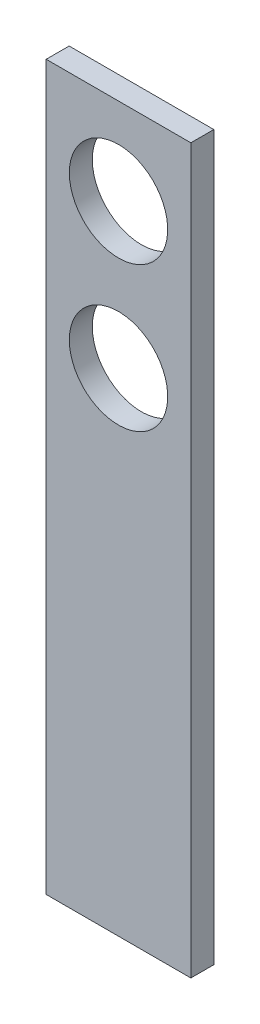
ISO-10303-21;
HEADER;
FILE_DESCRIPTION(('STEP AP214'),'2;1');
FILE_NAME('part.step','',(''),(''),'','','');
FILE_SCHEMA(('AUTOMOTIVE_DESIGN { 1 0 10303 214 1 1 1 1 }'));
ENDSEC;
DATA;
#1=APPLICATION_CONTEXT('core data for automotive mechanical design processes');
#2=APPLICATION_PROTOCOL_DEFINITION('international standard','automotive_design',2000,#1);
#3=PRODUCT_CONTEXT('',#1,'mechanical');
#4=PRODUCT('Part','Part','',(#3));
#5=PRODUCT_RELATED_PRODUCT_CATEGORY('part','',(#4));
#6=PRODUCT_DEFINITION_FORMATION('','',#4);
#7=PRODUCT_DEFINITION_CONTEXT('part definition',#1,'design');
#8=PRODUCT_DEFINITION('design','',#6,#7);
#9=PRODUCT_DEFINITION_SHAPE('','',#8);
#10=(LENGTH_UNIT() NAMED_UNIT(*) SI_UNIT(.MILLI.,.METRE.));
#11=(NAMED_UNIT(*) PLANE_ANGLE_UNIT() SI_UNIT($,.RADIAN.));
#12=(NAMED_UNIT(*) SI_UNIT($,.STERADIAN.) SOLID_ANGLE_UNIT());
#13=UNCERTAINTY_MEASURE_WITH_UNIT(LENGTH_MEASURE(1.E-05),#10,'distance_accuracy_value','');
#14=(GEOMETRIC_REPRESENTATION_CONTEXT(3) GLOBAL_UNCERTAINTY_ASSIGNED_CONTEXT((#13)) GLOBAL_UNIT_ASSIGNED_CONTEXT((#10,
#11,#12)) REPRESENTATION_CONTEXT('',''));
#15=CARTESIAN_POINT('',(0.,0.,0.));
#16=DIRECTION('',(0.,0.,1.));
#17=DIRECTION('',(1.,0.,0.));
#18=AXIS2_PLACEMENT_3D('',#15,#16,#17);
#19=CARTESIAN_POINT('',(-1.90934065934066,4.5467032967033,0.79375));
#20=DIRECTION('',(1.,0.,0.));
#21=DIRECTION('',(0.,1.,0.));
#22=AXIS2_PLACEMENT_3D('',#19,#20,#21);
#23=PLANE('',#22);
#24=DIRECTION('',(0.,-1.,0.));
#25=VECTOR('',#24,1.);
#26=CARTESIAN_POINT('',(-1.90934065934066,4.5467032967033,0.));
#27=LINE('',#26,#25);
#28=CARTESIAN_POINT('',(-1.90934065934066,4.5467032967033,0.));
#29=VERTEX_POINT('',#28);
#30=CARTESIAN_POINT('',(-1.90934065934066,-20.4532967032967,0.));
#31=VERTEX_POINT('',#30);
#32=EDGE_CURVE('E96',#29,#31,#27,.T.);
#33=ORIENTED_EDGE('',*,*,#32,.T.);
#34=DIRECTION('',(0.,0.,-1.));
#35=VECTOR('',#34,1.);
#36=CARTESIAN_POINT('',(-1.90934065934066,-20.4532967032967,0.79375));
#37=LINE('',#36,#35);
#38=CARTESIAN_POINT('',(-1.90934065934066,-20.4532967032967,0.79375));
#39=VERTEX_POINT('',#38);
#40=EDGE_CURVE('E11',#39,#31,#37,.T.);
#41=ORIENTED_EDGE('',*,*,#40,.F.);
#42=DIRECTION('',(0.,-1.,0.));
#43=VECTOR('',#42,1.);
#44=CARTESIAN_POINT('',(-1.90934065934066,4.5467032967033,0.79375));
#45=LINE('',#44,#43);
#46=CARTESIAN_POINT('',(-1.90934065934066,4.5467032967033,0.79375));
#47=VERTEX_POINT('',#46);
#48=EDGE_CURVE('E84',#47,#39,#45,.T.);
#49=ORIENTED_EDGE('',*,*,#48,.F.);
#50=DIRECTION('',(0.,0.,-1.));
#51=VECTOR('',#50,1.);
#52=CARTESIAN_POINT('',(-1.90934065934066,4.5467032967033,0.79375));
#53=LINE('',#52,#51);
#54=EDGE_CURVE('E92',#47,#29,#53,.T.);
#55=ORIENTED_EDGE('',*,*,#54,.T.);
#56=EDGE_LOOP('',(#33,#41,#49,#55));
#57=FACE_BOUND('',#56,.T.);
#58=ADVANCED_FACE('F33',(#57),#23,.F.);
#59=CARTESIAN_POINT('',(-1.90934065934066,-20.4532967032967,0.79375));
#60=DIRECTION('',(0.,1.,0.));
#61=DIRECTION('',(0.,0.,1.));
#62=AXIS2_PLACEMENT_3D('',#59,#60,#61);
#63=PLANE('',#62);
#64=DIRECTION('',(1.,0.,0.));
#65=VECTOR('',#64,1.);
#66=CARTESIAN_POINT('',(-1.90934065934066,-20.4532967032967,0.));
#67=LINE('',#66,#65);
#68=CARTESIAN_POINT('',(3.09065934065934,-20.4532967032967,0.));
#69=VERTEX_POINT('',#68);
#70=EDGE_CURVE('E88',#31,#69,#67,.T.);
#71=ORIENTED_EDGE('',*,*,#70,.T.);
#72=DIRECTION('',(0.,0.,-1.));
#73=VECTOR('',#72,1.);
#74=CARTESIAN_POINT('',(3.09065934065934,-20.4532967032967,0.79375));
#75=LINE('',#74,#73);
#76=CARTESIAN_POINT('',(3.09065934065934,-20.4532967032967,0.79375));
#77=VERTEX_POINT('',#76);
#78=EDGE_CURVE('E41',#77,#69,#75,.T.);
#79=ORIENTED_EDGE('',*,*,#78,.F.);
#80=DIRECTION('',(1.,0.,0.));
#81=VECTOR('',#80,1.);
#82=CARTESIAN_POINT('',(-1.90934065934066,-20.4532967032967,0.79375));
#83=LINE('',#82,#81);
#84=EDGE_CURVE('E79',#39,#77,#83,.T.);
#85=ORIENTED_EDGE('',*,*,#84,.F.);
#86=ORIENTED_EDGE('',*,*,#40,.T.);
#87=EDGE_LOOP('',(#71,#79,#85,#86));
#88=FACE_BOUND('',#87,.T.);
#89=ADVANCED_FACE('F87',(#88),#63,.F.);
#90=CARTESIAN_POINT('',(3.09065934065934,4.5467032967033,0.79375));
#91=DIRECTION('',(-1.,0.,0.));
#92=DIRECTION('',(0.,-1.,0.));
#93=AXIS2_PLACEMENT_3D('',#90,#91,#92);
#94=PLANE('',#93);
#95=DIRECTION('',(0.,1.,0.));
#96=VECTOR('',#95,1.);
#97=CARTESIAN_POINT('',(3.09065934065934,4.5467032967033,0.));
#98=LINE('',#97,#96);
#99=CARTESIAN_POINT('',(3.09065934065934,4.5467032967033,0.));
#100=VERTEX_POINT('',#99);
#101=EDGE_CURVE('E66',#69,#100,#98,.T.);
#102=ORIENTED_EDGE('',*,*,#101,.T.);
#103=DIRECTION('',(0.,0.,-1.));
#104=VECTOR('',#103,1.);
#105=CARTESIAN_POINT('',(3.09065934065934,4.5467032967033,0.79375));
#106=LINE('',#105,#104);
#107=CARTESIAN_POINT('',(3.09065934065934,4.5467032967033,0.79375));
#108=VERTEX_POINT('',#107);
#109=EDGE_CURVE('E89',#108,#100,#106,.T.);
#110=ORIENTED_EDGE('',*,*,#109,.F.);
#111=DIRECTION('',(0.,1.,0.));
#112=VECTOR('',#111,1.);
#113=CARTESIAN_POINT('',(3.09065934065934,4.5467032967033,0.79375));
#114=LINE('',#113,#112);
#115=EDGE_CURVE('E82',#77,#108,#114,.T.);
#116=ORIENTED_EDGE('',*,*,#115,.F.);
#117=ORIENTED_EDGE('',*,*,#78,.T.);
#118=EDGE_LOOP('',(#102,#110,#116,#117));
#119=FACE_BOUND('',#118,.T.);
#120=ADVANCED_FACE('F90',(#119),#94,.F.);
#121=CARTESIAN_POINT('',(-1.90934065934066,4.5467032967033,0.79375));
#122=DIRECTION('',(0.,-1.,0.));
#123=DIRECTION('',(0.,0.,-1.));
#124=AXIS2_PLACEMENT_3D('',#121,#122,#123);
#125=PLANE('',#124);
#126=DIRECTION('',(-1.,0.,0.));
#127=VECTOR('',#126,1.);
#128=CARTESIAN_POINT('',(-1.90934065934066,4.5467032967033,0.));
#129=LINE('',#128,#127);
#130=EDGE_CURVE('E72',#100,#29,#129,.T.);
#131=ORIENTED_EDGE('',*,*,#130,.T.);
#132=ORIENTED_EDGE('',*,*,#54,.F.);
#133=DIRECTION('',(-1.,0.,0.));
#134=VECTOR('',#133,1.);
#135=CARTESIAN_POINT('',(-1.90934065934066,4.5467032967033,0.79375));
#136=LINE('',#135,#134);
#137=EDGE_CURVE('E49',#108,#47,#136,.T.);
#138=ORIENTED_EDGE('',*,*,#137,.F.);
#139=ORIENTED_EDGE('',*,*,#109,.T.);
#140=EDGE_LOOP('',(#131,#132,#138,#139));
#141=FACE_BOUND('',#140,.T.);
#142=ADVANCED_FACE('F104',(#141),#125,.F.);
#143=CARTESIAN_POINT('',(0.,0.,0.79375));
#144=DIRECTION('',(0.,0.,1.));
#145=DIRECTION('',(1.,0.,0.));
#146=AXIS2_PLACEMENT_3D('',#143,#144,#145);
#147=PLANE('',#146);
#148=CARTESIAN_POINT('',(0.590659340659339,1.5467032967033,0.793749999999999));
#149=DIRECTION('',(0.,0.,-1.));
#150=DIRECTION('',(-1.,0.,0.));
#151=AXIS2_PLACEMENT_3D('',#148,#149,#150);
#152=CIRCLE('',#151,1.7);
#153=CARTESIAN_POINT('',(-1.10934065934066,1.5467032967033,0.793749999999999));
#154=VERTEX_POINT('',#153);
#155=EDGE_CURVE('E115',#154,#154,#152,.T.);
#156=ORIENTED_EDGE('',*,*,#155,.T.);
#157=EDGE_LOOP('',(#156));
#158=FACE_BOUND('',#157,.T.);
#159=CARTESIAN_POINT('',(0.590659340659339,-3.4532967032967,0.793749999999999));
#160=DIRECTION('',(0.,0.,-1.));
#161=DIRECTION('',(-1.,0.,0.));
#162=AXIS2_PLACEMENT_3D('',#159,#160,#161);
#163=CIRCLE('',#162,1.7);
#164=CARTESIAN_POINT('',(-1.10934065934066,-3.4532967032967,0.793749999999999));
#165=VERTEX_POINT('',#164);
#166=EDGE_CURVE('E99',#165,#165,#163,.T.);
#167=ORIENTED_EDGE('',*,*,#166,.T.);
#168=EDGE_LOOP('',(#167));
#169=FACE_BOUND('',#168,.T.);
#170=ORIENTED_EDGE('',*,*,#48,.T.);
#171=ORIENTED_EDGE('',*,*,#84,.T.);
#172=ORIENTED_EDGE('',*,*,#115,.T.);
#173=ORIENTED_EDGE('',*,*,#137,.T.);
#174=EDGE_LOOP('',(#170,#171,#172,#173));
#175=FACE_BOUND('',#174,.T.);
#176=ADVANCED_FACE('F80',(#158,#169,#175),#147,.T.);
#177=CARTESIAN_POINT('',(0.,0.,0.));
#178=DIRECTION('',(0.,0.,1.));
#179=DIRECTION('',(1.,0.,0.));
#180=AXIS2_PLACEMENT_3D('',#177,#178,#179);
#181=PLANE('',#180);
#182=CARTESIAN_POINT('',(0.590659340659339,1.5467032967033,0.));
#183=DIRECTION('',(0.,0.,-1.));
#184=DIRECTION('',(-1.,0.,0.));
#185=AXIS2_PLACEMENT_3D('',#182,#183,#184);
#186=CIRCLE('',#185,1.69999999999999);
#187=CARTESIAN_POINT('',(-1.10934065934065,1.5467032967033,0.));
#188=VERTEX_POINT('',#187);
#189=EDGE_CURVE('E118',#188,#188,#186,.T.);
#190=ORIENTED_EDGE('',*,*,#189,.F.);
#191=EDGE_LOOP('',(#190));
#192=FACE_BOUND('',#191,.T.);
#193=CARTESIAN_POINT('',(0.590659340659339,-3.4532967032967,0.));
#194=DIRECTION('',(0.,0.,-1.));
#195=DIRECTION('',(-1.,0.,0.));
#196=AXIS2_PLACEMENT_3D('',#193,#194,#195);
#197=CIRCLE('',#196,1.69999999999999);
#198=CARTESIAN_POINT('',(-1.10934065934065,-3.4532967032967,0.));
#199=VERTEX_POINT('',#198);
#200=EDGE_CURVE('E112',#199,#199,#197,.T.);
#201=ORIENTED_EDGE('',*,*,#200,.F.);
#202=EDGE_LOOP('',(#201));
#203=FACE_BOUND('',#202,.T.);
#204=ORIENTED_EDGE('',*,*,#32,.F.);
#205=ORIENTED_EDGE('',*,*,#130,.F.);
#206=ORIENTED_EDGE('',*,*,#101,.F.);
#207=ORIENTED_EDGE('',*,*,#70,.F.);
#208=EDGE_LOOP('',(#204,#205,#206,#207));
#209=FACE_BOUND('',#208,.T.);
#210=ADVANCED_FACE('F107',(#192,#203,#209),#181,.F.);
#211=CARTESIAN_POINT('',(0.590659340659339,-3.4532967032967,0.));
#212=DIRECTION('',(0.,0.,-1.));
#213=DIRECTION('',(-1.,0.,0.));
#214=AXIS2_PLACEMENT_3D('',#211,#212,#213);
#215=CYLINDRICAL_SURFACE('',#214,1.69999999999999);
#216=ORIENTED_EDGE('',*,*,#166,.F.);
#217=EDGE_LOOP('',(#216));
#218=FACE_BOUND('',#217,.T.);
#219=ORIENTED_EDGE('',*,*,#200,.T.);
#220=EDGE_LOOP('',(#219));
#221=FACE_BOUND('',#220,.T.);
#222=ADVANCED_FACE('F126',(#218,#221),#215,.F.);
#223=CARTESIAN_POINT('',(0.590659340659339,1.5467032967033,0.));
#224=DIRECTION('',(0.,0.,-1.));
#225=DIRECTION('',(-1.,0.,0.));
#226=AXIS2_PLACEMENT_3D('',#223,#224,#225);
#227=CYLINDRICAL_SURFACE('',#226,1.69999999999999);
#228=ORIENTED_EDGE('',*,*,#155,.F.);
#229=EDGE_LOOP('',(#228));
#230=FACE_BOUND('',#229,.T.);
#231=ORIENTED_EDGE('',*,*,#189,.T.);
#232=EDGE_LOOP('',(#231));
#233=FACE_BOUND('',#232,.T.);
#234=ADVANCED_FACE('F122',(#230,#233),#227,.F.);
#235=CLOSED_SHELL('',(#58,#89,#120,#142,#176,#210,#222,#234));
#236=MANIFOLD_SOLID_BREP('B2',#235);
#237=ADVANCED_BREP_SHAPE_REPRESENTATION('',(#18,#236),#14);
#238=SHAPE_DEFINITION_REPRESENTATION(#9,#237);
ENDSEC;
END-ISO-10303-21;
